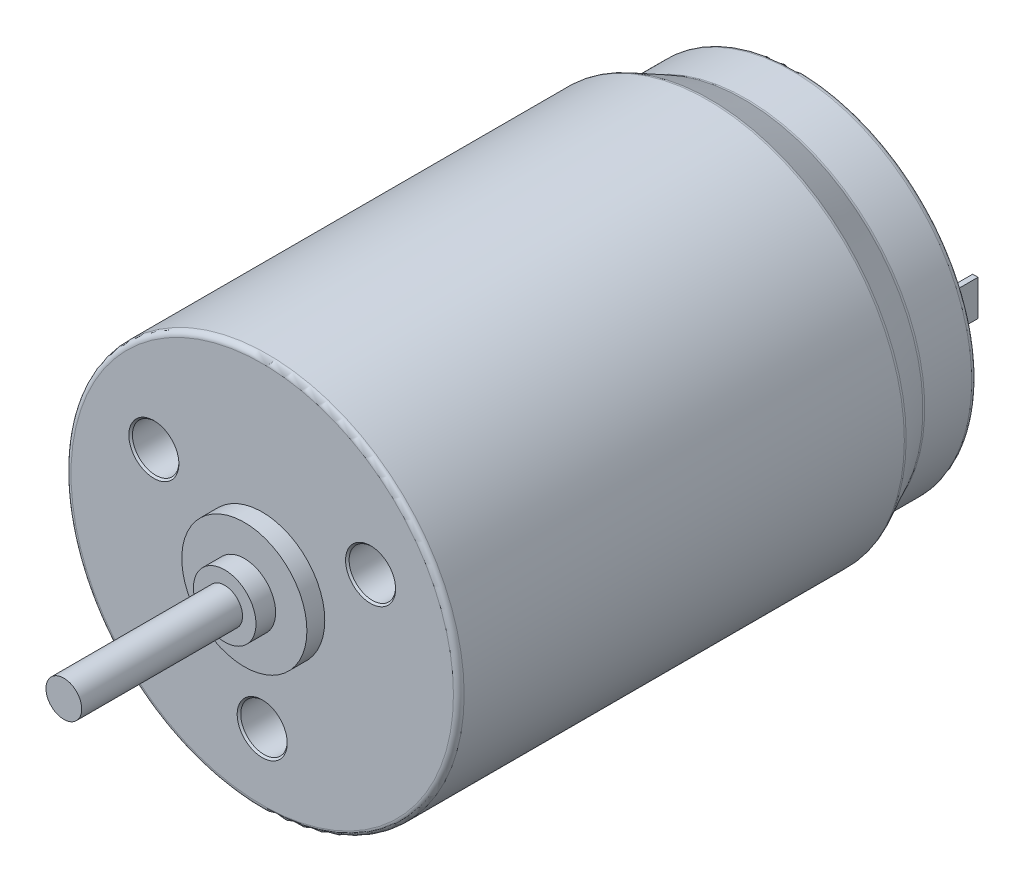
ISO-10303-21;
HEADER;
FILE_DESCRIPTION(('STEP AP214'),'2;1');
FILE_NAME('part.step','',(''),(''),'','','');
FILE_SCHEMA(('AUTOMOTIVE_DESIGN { 1 0 10303 214 1 1 1 1 }'));
ENDSEC;
DATA;
#1=APPLICATION_CONTEXT('core data for automotive mechanical design processes');
#2=APPLICATION_PROTOCOL_DEFINITION('international standard','automotive_design',2000,#1);
#3=PRODUCT_CONTEXT('',#1,'mechanical');
#4=PRODUCT('Part','Part','',(#3));
#5=PRODUCT_RELATED_PRODUCT_CATEGORY('part','',(#4));
#6=PRODUCT_DEFINITION_FORMATION('','',#4);
#7=PRODUCT_DEFINITION_CONTEXT('part definition',#1,'design');
#8=PRODUCT_DEFINITION('design','',#6,#7);
#9=PRODUCT_DEFINITION_SHAPE('','',#8);
#10=(LENGTH_UNIT() NAMED_UNIT(*) SI_UNIT(.MILLI.,.METRE.));
#11=(NAMED_UNIT(*) PLANE_ANGLE_UNIT() SI_UNIT($,.RADIAN.));
#12=(NAMED_UNIT(*) SI_UNIT($,.STERADIAN.) SOLID_ANGLE_UNIT());
#13=UNCERTAINTY_MEASURE_WITH_UNIT(LENGTH_MEASURE(1.E-05),#10,'distance_accuracy_value','');
#14=(GEOMETRIC_REPRESENTATION_CONTEXT(3) GLOBAL_UNCERTAINTY_ASSIGNED_CONTEXT((#13)) GLOBAL_UNIT_ASSIGNED_CONTEXT((#10,
#11,#12)) REPRESENTATION_CONTEXT('',''));
#15=CARTESIAN_POINT('',(0.,0.,0.));
#16=DIRECTION('',(0.,0.,1.));
#17=DIRECTION('',(1.,0.,0.));
#18=AXIS2_PLACEMENT_3D('',#15,#16,#17);
#19=CARTESIAN_POINT('',(0.,0.,-30.));
#20=DIRECTION('',(0.,0.,-1.));
#21=DIRECTION('',(-1.,0.,0.));
#22=AXIS2_PLACEMENT_3D('',#19,#20,#21);
#23=PLANE('',#22);
#24=CARTESIAN_POINT('',(0.,0.,-30.));
#25=DIRECTION('',(0.,0.,-1.));
#26=DIRECTION('',(-1.,0.,0.));
#27=AXIS2_PLACEMENT_3D('',#24,#25,#26);
#28=CIRCLE('',#27,9.7);
#29=CARTESIAN_POINT('',(-9.7,0.,-30.));
#30=VERTEX_POINT('',#29);
#31=EDGE_CURVE('E166',#30,#30,#28,.T.);
#32=ORIENTED_EDGE('',*,*,#31,.T.);
#33=EDGE_LOOP('',(#32));
#34=FACE_BOUND('',#33,.T.);
#35=DIRECTION('',(1.,0.,0.));
#36=VECTOR('',#35,1.);
#37=CARTESIAN_POINT('',(6.15,1.,-30.));
#38=LINE('',#37,#36);
#39=CARTESIAN_POINT('',(5.85,1.,-30.));
#40=VERTEX_POINT('',#39);
#41=CARTESIAN_POINT('',(6.15,1.,-30.));
#42=VERTEX_POINT('',#41);
#43=EDGE_CURVE('E131',#40,#42,#38,.T.);
#44=ORIENTED_EDGE('',*,*,#43,.F.);
#45=DIRECTION('',(0.,1.,0.));
#46=VECTOR('',#45,1.);
#47=CARTESIAN_POINT('',(5.85,1.,-30.));
#48=LINE('',#47,#46);
#49=CARTESIAN_POINT('',(5.85,-1.,-30.));
#50=VERTEX_POINT('',#49);
#51=EDGE_CURVE('E128',#50,#40,#48,.T.);
#52=ORIENTED_EDGE('',*,*,#51,.F.);
#53=DIRECTION('',(-1.,0.,0.));
#54=VECTOR('',#53,1.);
#55=CARTESIAN_POINT('',(6.15,-1.,-30.));
#56=LINE('',#55,#54);
#57=CARTESIAN_POINT('',(6.15,-1.,-30.));
#58=VERTEX_POINT('',#57);
#59=EDGE_CURVE('E140',#58,#50,#56,.T.);
#60=ORIENTED_EDGE('',*,*,#59,.F.);
#61=DIRECTION('',(0.,-1.,0.));
#62=VECTOR('',#61,1.);
#63=CARTESIAN_POINT('',(6.15,1.,-30.));
#64=LINE('',#63,#62);
#65=EDGE_CURVE('E148',#42,#58,#64,.T.);
#66=ORIENTED_EDGE('',*,*,#65,.F.);
#67=EDGE_LOOP('',(#44,#52,#60,#66));
#68=FACE_BOUND('',#67,.T.);
#69=DIRECTION('',(1.,0.,0.));
#70=VECTOR('',#69,1.);
#71=CARTESIAN_POINT('',(-5.85,1.,-30.));
#72=LINE('',#71,#70);
#73=CARTESIAN_POINT('',(-6.15,1.,-30.));
#74=VERTEX_POINT('',#73);
#75=CARTESIAN_POINT('',(-5.85,1.,-30.));
#76=VERTEX_POINT('',#75);
#77=EDGE_CURVE('E594',#74,#76,#72,.T.);
#78=ORIENTED_EDGE('',*,*,#77,.F.);
#79=DIRECTION('',(0.,1.,0.));
#80=VECTOR('',#79,1.);
#81=CARTESIAN_POINT('',(-6.15,1.,-30.));
#82=LINE('',#81,#80);
#83=CARTESIAN_POINT('',(-6.15,-1.,-30.));
#84=VERTEX_POINT('',#83);
#85=EDGE_CURVE('E126',#84,#74,#82,.T.);
#86=ORIENTED_EDGE('',*,*,#85,.F.);
#87=DIRECTION('',(-1.,0.,0.));
#88=VECTOR('',#87,1.);
#89=CARTESIAN_POINT('',(-5.85,-1.,-30.));
#90=LINE('',#89,#88);
#91=CARTESIAN_POINT('',(-5.85,-1.,-30.));
#92=VERTEX_POINT('',#91);
#93=EDGE_CURVE('E122',#92,#84,#90,.T.);
#94=ORIENTED_EDGE('',*,*,#93,.F.);
#95=DIRECTION('',(0.,-1.,0.));
#96=VECTOR('',#95,1.);
#97=CARTESIAN_POINT('',(-5.85,1.,-30.));
#98=LINE('',#97,#96);
#99=EDGE_CURVE('E591',#76,#92,#98,.T.);
#100=ORIENTED_EDGE('',*,*,#99,.F.);
#101=EDGE_LOOP('',(#78,#86,#94,#100));
#102=FACE_BOUND('',#101,.T.);
#103=ADVANCED_FACE('F37',(#34,#68,#102),#23,.T.);
#104=CARTESIAN_POINT('',(0.,0.,-25.));
#105=DIRECTION('',(0.,0.,1.));
#106=DIRECTION('',(1.,0.,0.));
#107=AXIS2_PLACEMENT_3D('',#104,#105,#106);
#108=CYLINDRICAL_SURFACE('',#107,11.);
#109=CARTESIAN_POINT('',(0.,0.,-24.9291796067501));
#110=DIRECTION('',(0.,0.,1.));
#111=DIRECTION('',(1.,0.,0.));
#112=AXIS2_PLACEMENT_3D('',#109,#110,#111);
#113=CIRCLE('',#112,11.);
#114=CARTESIAN_POINT('',(11.,0.,-24.9291796067501));
#115=VERTEX_POINT('',#114);
#116=EDGE_CURVE('E45',#115,#115,#113,.T.);
#117=ORIENTED_EDGE('',*,*,#116,.T.);
#118=EDGE_LOOP('',(#117));
#119=FACE_BOUND('',#118,.T.);
#120=CARTESIAN_POINT('',(0.,0.,-0.300000000000002));
#121=DIRECTION('',(0.,0.,1.));
#122=DIRECTION('',(1.,0.,0.));
#123=AXIS2_PLACEMENT_3D('',#120,#121,#122);
#124=CIRCLE('',#123,11.);
#125=CARTESIAN_POINT('',(11.,0.,-0.300000000000002));
#126=VERTEX_POINT('',#125);
#127=EDGE_CURVE('E219',#126,#126,#124,.F.);
#128=ORIENTED_EDGE('',*,*,#127,.T.);
#129=EDGE_LOOP('',(#128));
#130=FACE_BOUND('',#129,.T.);
#131=ADVANCED_FACE('F224',(#119,#130),#108,.T.);
#132=CARTESIAN_POINT('',(0.,0.,0.));
#133=DIRECTION('',(0.,0.,1.));
#134=DIRECTION('',(1.,0.,0.));
#135=AXIS2_PLACEMENT_3D('',#132,#133,#134);
#136=PLANE('',#135);
#137=CARTESIAN_POINT('',(0.,0.,0.));
#138=DIRECTION('',(0.,0.,1.));
#139=DIRECTION('',(1.,0.,0.));
#140=AXIS2_PLACEMENT_3D('',#137,#138,#139);
#141=CIRCLE('',#140,10.7);
#142=CARTESIAN_POINT('',(10.7,0.,0.));
#143=VERTEX_POINT('',#142);
#144=EDGE_CURVE('E12',#143,#143,#141,.T.);
#145=ORIENTED_EDGE('',*,*,#144,.T.);
#146=EDGE_LOOP('',(#145));
#147=FACE_BOUND('',#146,.T.);
#148=CARTESIAN_POINT('',(0.,0.,0.));
#149=DIRECTION('',(0.,0.,1.));
#150=DIRECTION('',(1.,0.,0.));
#151=AXIS2_PLACEMENT_3D('',#148,#149,#150);
#152=CIRCLE('',#151,3.5);
#153=CARTESIAN_POINT('',(3.5,0.,0.));
#154=VERTEX_POINT('',#153);
#155=EDGE_CURVE('E170',#154,#154,#152,.T.);
#156=ORIENTED_EDGE('',*,*,#155,.F.);
#157=EDGE_LOOP('',(#156));
#158=FACE_BOUND('',#157,.T.);
#159=CARTESIAN_POINT('',(0.,-7.,0.));
#160=DIRECTION('',(0.,0.,1.));
#161=DIRECTION('',(1.,0.,0.));
#162=AXIS2_PLACEMENT_3D('',#159,#160,#161);
#163=CIRCLE('',#162,1.4);
#164=CARTESIAN_POINT('',(1.4,-7.,0.));
#165=VERTEX_POINT('',#164);
#166=EDGE_CURVE('E197',#165,#165,#163,.F.);
#167=ORIENTED_EDGE('',*,*,#166,.T.);
#168=EDGE_LOOP('',(#167));
#169=FACE_BOUND('',#168,.T.);
#170=CARTESIAN_POINT('',(6.06217782649108,3.49999999999998,0.));
#171=DIRECTION('',(0.,0.,1.));
#172=DIRECTION('',(1.,0.,0.));
#173=AXIS2_PLACEMENT_3D('',#170,#171,#172);
#174=CIRCLE('',#173,1.40000000000001);
#175=CARTESIAN_POINT('',(7.46217782649109,3.49999999999998,0.));
#176=VERTEX_POINT('',#175);
#177=EDGE_CURVE('E194',#176,#176,#174,.F.);
#178=ORIENTED_EDGE('',*,*,#177,.T.);
#179=EDGE_LOOP('',(#178));
#180=FACE_BOUND('',#179,.T.);
#181=CARTESIAN_POINT('',(-6.06217782649108,3.49999999999998,0.));
#182=DIRECTION('',(0.,0.,1.));
#183=DIRECTION('',(1.,0.,0.));
#184=AXIS2_PLACEMENT_3D('',#181,#182,#183);
#185=CIRCLE('',#184,1.40000000000001);
#186=CARTESIAN_POINT('',(-4.66217782649107,3.49999999999998,0.));
#187=VERTEX_POINT('',#186);
#188=EDGE_CURVE('E191',#187,#187,#185,.F.);
#189=ORIENTED_EDGE('',*,*,#188,.T.);
#190=EDGE_LOOP('',(#189));
#191=FACE_BOUND('',#190,.T.);
#192=ADVANCED_FACE('F236',(#147,#158,#169,#180,#191),#136,.T.);
#193=CARTESIAN_POINT('',(0.,0.,-27.));
#194=DIRECTION('',(0.,0.,1.));
#195=DIRECTION('',(1.,0.,0.));
#196=AXIS2_PLACEMENT_3D('',#193,#194,#195);
#197=CONICAL_SURFACE('',#196,10.,0.463647609000805);
#198=CARTESIAN_POINT('',(0.,0.,-26.9366563146));
#199=DIRECTION('',(0.,0.,-1.));
#200=DIRECTION('',(-1.,0.,0.));
#201=AXIS2_PLACEMENT_3D('',#198,#199,#200);
#202=CIRCLE('',#201,10.0316718427);
#203=CARTESIAN_POINT('',(-10.0316718427,0.,-26.9366563146));
#204=VERTEX_POINT('',#203);
#205=EDGE_CURVE('E216',#204,#204,#202,.F.);
#206=ORIENTED_EDGE('',*,*,#205,.T.);
#207=EDGE_LOOP('',(#206));
#208=FACE_BOUND('',#207,.T.);
#209=CARTESIAN_POINT('',(0.,0.,-25.0633436854));
#210=DIRECTION('',(0.,0.,-1.));
#211=DIRECTION('',(-1.,0.,0.));
#212=AXIS2_PLACEMENT_3D('',#209,#210,#211);
#213=CIRCLE('',#212,10.9683281573);
#214=CARTESIAN_POINT('',(-10.9683281573,0.,-25.0633436854));
#215=VERTEX_POINT('',#214);
#216=EDGE_CURVE('E213',#215,#215,#213,.T.);
#217=ORIENTED_EDGE('',*,*,#216,.T.);
#218=EDGE_LOOP('',(#217));
#219=FACE_BOUND('',#218,.T.);
#220=ADVANCED_FACE('F233',(#208,#219),#197,.T.);
#221=CARTESIAN_POINT('',(0.,0.,-30.));
#222=DIRECTION('',(0.,0.,1.));
#223=DIRECTION('',(1.,0.,0.));
#224=AXIS2_PLACEMENT_3D('',#221,#222,#223);
#225=CYLINDRICAL_SURFACE('',#224,10.);
#226=CARTESIAN_POINT('',(0.,0.,-29.7));
#227=DIRECTION('',(0.,0.,-1.));
#228=DIRECTION('',(-1.,0.,0.));
#229=AXIS2_PLACEMENT_3D('',#226,#227,#228);
#230=CIRCLE('',#229,10.);
#231=CARTESIAN_POINT('',(-10.,0.,-29.7));
#232=VERTEX_POINT('',#231);
#233=EDGE_CURVE('E210',#232,#232,#230,.F.);
#234=ORIENTED_EDGE('',*,*,#233,.T.);
#235=EDGE_LOOP('',(#234));
#236=FACE_BOUND('',#235,.T.);
#237=CARTESIAN_POINT('',(0.,0.,-27.0708203932499));
#238=DIRECTION('',(0.,0.,-1.));
#239=DIRECTION('',(-1.,0.,0.));
#240=AXIS2_PLACEMENT_3D('',#237,#238,#239);
#241=CIRCLE('',#240,10.);
#242=CARTESIAN_POINT('',(-10.,0.,-27.0708203932499));
#243=VERTEX_POINT('',#242);
#244=EDGE_CURVE('E207',#243,#243,#241,.T.);
#245=ORIENTED_EDGE('',*,*,#244,.T.);
#246=EDGE_LOOP('',(#245));
#247=FACE_BOUND('',#246,.T.);
#248=ADVANCED_FACE('F235',(#236,#247),#225,.T.);
#249=CARTESIAN_POINT('',(0.,-7.,-5.));
#250=DIRECTION('',(0.,0.,1.));
#251=DIRECTION('',(1.,0.,0.));
#252=AXIS2_PLACEMENT_3D('',#249,#250,#251);
#253=CYLINDRICAL_SURFACE('',#252,1.3);
#254=CARTESIAN_POINT('',(0.,-7.,-0.0999999999999951));
#255=DIRECTION('',(0.,0.,1.));
#256=DIRECTION('',(1.,0.,0.));
#257=AXIS2_PLACEMENT_3D('',#254,#255,#256);
#258=CIRCLE('',#257,1.3);
#259=CARTESIAN_POINT('',(1.3,-7.,-0.0999999999999951));
#260=VERTEX_POINT('',#259);
#261=EDGE_CURVE('E183',#260,#260,#258,.T.);
#262=ORIENTED_EDGE('',*,*,#261,.T.);
#263=EDGE_LOOP('',(#262));
#264=FACE_BOUND('',#263,.T.);
#265=CARTESIAN_POINT('',(0.,-7.,-5.));
#266=DIRECTION('',(0.,0.,1.));
#267=DIRECTION('',(1.,0.,0.));
#268=AXIS2_PLACEMENT_3D('',#265,#266,#267);
#269=CIRCLE('',#268,1.3);
#270=CARTESIAN_POINT('',(1.3,-7.,-5.));
#271=VERTEX_POINT('',#270);
#272=EDGE_CURVE('E177',#271,#271,#269,.T.);
#273=ORIENTED_EDGE('',*,*,#272,.F.);
#274=EDGE_LOOP('',(#273));
#275=FACE_BOUND('',#274,.T.);
#276=ADVANCED_FACE('F243',(#264,#275),#253,.F.);
#277=CARTESIAN_POINT('',(0.,-7.,-5.));
#278=DIRECTION('',(0.,0.,1.));
#279=DIRECTION('',(1.,0.,0.));
#280=AXIS2_PLACEMENT_3D('',#277,#278,#279);
#281=PLANE('',#280);
#282=ORIENTED_EDGE('',*,*,#272,.T.);
#283=EDGE_LOOP('',(#282));
#284=FACE_BOUND('',#283,.T.);
#285=ADVANCED_FACE('F259',(#284),#281,.T.);
#286=CARTESIAN_POINT('',(6.06217782649108,3.49999999999998,-5.));
#287=DIRECTION('',(0.,0.,1.));
#288=DIRECTION('',(1.,0.,0.));
#289=AXIS2_PLACEMENT_3D('',#286,#287,#288);
#290=CYLINDRICAL_SURFACE('',#289,1.3);
#291=CARTESIAN_POINT('',(6.06217782649108,3.49999999999998,-0.100000000000004));
#292=DIRECTION('',(0.,0.,1.));
#293=DIRECTION('',(1.,0.,0.));
#294=AXIS2_PLACEMENT_3D('',#291,#292,#293);
#295=CIRCLE('',#294,1.3);
#296=CARTESIAN_POINT('',(7.36217782649108,3.49999999999998,-0.100000000000004));
#297=VERTEX_POINT('',#296);
#298=EDGE_CURVE('E200',#297,#297,#295,.T.);
#299=ORIENTED_EDGE('',*,*,#298,.T.);
#300=EDGE_LOOP('',(#299));
#301=FACE_BOUND('',#300,.T.);
#302=CARTESIAN_POINT('',(6.06217782649108,3.49999999999998,-5.));
#303=DIRECTION('',(0.,0.,1.));
#304=DIRECTION('',(1.,0.,0.));
#305=AXIS2_PLACEMENT_3D('',#302,#303,#304);
#306=CIRCLE('',#305,1.3);
#307=CARTESIAN_POINT('',(7.36217782649108,3.49999999999998,-5.));
#308=VERTEX_POINT('',#307);
#309=EDGE_CURVE('E184',#308,#308,#306,.T.);
#310=ORIENTED_EDGE('',*,*,#309,.F.);
#311=EDGE_LOOP('',(#310));
#312=FACE_BOUND('',#311,.T.);
#313=ADVANCED_FACE('F263',(#301,#312),#290,.F.);
#314=CARTESIAN_POINT('',(6.06217782649108,3.49999999999998,-5.));
#315=DIRECTION('',(0.,0.,1.));
#316=DIRECTION('',(1.,0.,0.));
#317=AXIS2_PLACEMENT_3D('',#314,#315,#316);
#318=PLANE('',#317);
#319=ORIENTED_EDGE('',*,*,#309,.T.);
#320=EDGE_LOOP('',(#319));
#321=FACE_BOUND('',#320,.T.);
#322=ADVANCED_FACE('F267',(#321),#318,.T.);
#323=CARTESIAN_POINT('',(-6.06217782649108,3.49999999999998,-5.));
#324=DIRECTION('',(0.,0.,1.));
#325=DIRECTION('',(1.,0.,0.));
#326=AXIS2_PLACEMENT_3D('',#323,#324,#325);
#327=CYLINDRICAL_SURFACE('',#326,1.3);
#328=CARTESIAN_POINT('',(-6.06217782649108,3.49999999999998,-0.100000000000004));
#329=DIRECTION('',(0.,0.,1.));
#330=DIRECTION('',(1.,0.,0.));
#331=AXIS2_PLACEMENT_3D('',#328,#329,#330);
#332=CIRCLE('',#331,1.3);
#333=CARTESIAN_POINT('',(-4.76217782649108,3.49999999999998,-0.100000000000004));
#334=VERTEX_POINT('',#333);
#335=EDGE_CURVE('E173',#334,#334,#332,.T.);
#336=ORIENTED_EDGE('',*,*,#335,.T.);
#337=EDGE_LOOP('',(#336));
#338=FACE_BOUND('',#337,.T.);
#339=CARTESIAN_POINT('',(-6.06217782649108,3.49999999999998,-5.));
#340=DIRECTION('',(0.,0.,1.));
#341=DIRECTION('',(1.,0.,0.));
#342=AXIS2_PLACEMENT_3D('',#339,#340,#341);
#343=CIRCLE('',#342,1.3);
#344=CARTESIAN_POINT('',(-4.76217782649108,3.49999999999998,-5.));
#345=VERTEX_POINT('',#344);
#346=EDGE_CURVE('E180',#345,#345,#343,.T.);
#347=ORIENTED_EDGE('',*,*,#346,.F.);
#348=EDGE_LOOP('',(#347));
#349=FACE_BOUND('',#348,.T.);
#350=ADVANCED_FACE('F271',(#338,#349),#327,.F.);
#351=CARTESIAN_POINT('',(-6.06217782649108,3.49999999999998,-5.));
#352=DIRECTION('',(0.,0.,1.));
#353=DIRECTION('',(1.,0.,0.));
#354=AXIS2_PLACEMENT_3D('',#351,#352,#353);
#355=PLANE('',#354);
#356=ORIENTED_EDGE('',*,*,#346,.T.);
#357=EDGE_LOOP('',(#356));
#358=FACE_BOUND('',#357,.T.);
#359=ADVANCED_FACE('F275',(#358),#355,.T.);
#360=CARTESIAN_POINT('',(0.,-7.,-0.0999999999999951));
#361=DIRECTION('',(0.,0.,1.));
#362=DIRECTION('',(1.,0.,0.));
#363=AXIS2_PLACEMENT_3D('',#360,#361,#362);
#364=CONICAL_SURFACE('',#363,1.3,0.785398163397466);
#365=ORIENTED_EDGE('',*,*,#166,.F.);
#366=EDGE_LOOP('',(#365));
#367=FACE_BOUND('',#366,.T.);
#368=ORIENTED_EDGE('',*,*,#261,.F.);
#369=EDGE_LOOP('',(#368));
#370=FACE_BOUND('',#369,.T.);
#371=ADVANCED_FACE('F279',(#367,#370),#364,.F.);
#372=CARTESIAN_POINT('',(6.06217782649108,3.49999999999998,-0.100000000000004));
#373=DIRECTION('',(0.,0.,1.));
#374=DIRECTION('',(1.,0.,0.));
#375=AXIS2_PLACEMENT_3D('',#372,#373,#374);
#376=CONICAL_SURFACE('',#375,1.3,0.785398163397475);
#377=ORIENTED_EDGE('',*,*,#177,.F.);
#378=EDGE_LOOP('',(#377));
#379=FACE_BOUND('',#378,.T.);
#380=ORIENTED_EDGE('',*,*,#298,.F.);
#381=EDGE_LOOP('',(#380));
#382=FACE_BOUND('',#381,.T.);
#383=ADVANCED_FACE('F353',(#379,#382),#376,.F.);
#384=CARTESIAN_POINT('',(-6.06217782649108,3.49999999999998,-0.100000000000004));
#385=DIRECTION('',(0.,0.,1.));
#386=DIRECTION('',(1.,0.,0.));
#387=AXIS2_PLACEMENT_3D('',#384,#385,#386);
#388=CONICAL_SURFACE('',#387,1.3,0.785398163397475);
#389=ORIENTED_EDGE('',*,*,#188,.F.);
#390=EDGE_LOOP('',(#389));
#391=FACE_BOUND('',#390,.T.);
#392=ORIENTED_EDGE('',*,*,#335,.F.);
#393=EDGE_LOOP('',(#392));
#394=FACE_BOUND('',#393,.T.);
#395=ADVANCED_FACE('F285',(#391,#394),#388,.F.);
#396=CARTESIAN_POINT('',(0.,0.,1.));
#397=DIRECTION('',(0.,0.,-1.));
#398=DIRECTION('',(-1.,0.,0.));
#399=AXIS2_PLACEMENT_3D('',#396,#397,#398);
#400=CYLINDRICAL_SURFACE('',#399,3.5);
#401=CARTESIAN_POINT('',(0.,0.,1.));
#402=DIRECTION('',(0.,0.,1.));
#403=DIRECTION('',(1.,0.,0.));
#404=AXIS2_PLACEMENT_3D('',#401,#402,#403);
#405=CIRCLE('',#404,3.5);
#406=CARTESIAN_POINT('',(3.5,0.,1.));
#407=VERTEX_POINT('',#406);
#408=EDGE_CURVE('E174',#407,#407,#405,.T.);
#409=ORIENTED_EDGE('',*,*,#408,.F.);
#410=EDGE_LOOP('',(#409));
#411=FACE_BOUND('',#410,.T.);
#412=ORIENTED_EDGE('',*,*,#155,.T.);
#413=EDGE_LOOP('',(#412));
#414=FACE_BOUND('',#413,.T.);
#415=ADVANCED_FACE('F281',(#411,#414),#400,.T.);
#416=CARTESIAN_POINT('',(0.,0.,1.));
#417=DIRECTION('',(0.,0.,1.));
#418=DIRECTION('',(1.,0.,0.));
#419=AXIS2_PLACEMENT_3D('',#416,#417,#418);
#420=PLANE('',#419);
#421=CARTESIAN_POINT('',(0.,0.,1.));
#422=DIRECTION('',(0.,0.,1.));
#423=DIRECTION('',(1.,0.,0.));
#424=AXIS2_PLACEMENT_3D('',#421,#422,#423);
#425=CIRCLE('',#424,1.75);
#426=CARTESIAN_POINT('',(1.75,0.,1.));
#427=VERTEX_POINT('',#426);
#428=EDGE_CURVE('E167',#427,#427,#425,.T.);
#429=ORIENTED_EDGE('',*,*,#428,.F.);
#430=EDGE_LOOP('',(#429));
#431=FACE_BOUND('',#430,.T.);
#432=ORIENTED_EDGE('',*,*,#408,.T.);
#433=EDGE_LOOP('',(#432));
#434=FACE_BOUND('',#433,.T.);
#435=ADVANCED_FACE('F284',(#431,#434),#420,.T.);
#436=CARTESIAN_POINT('',(0.,0.,2.1));
#437=DIRECTION('',(0.,0.,-1.));
#438=DIRECTION('',(-1.,0.,0.));
#439=AXIS2_PLACEMENT_3D('',#436,#437,#438);
#440=CYLINDRICAL_SURFACE('',#439,1.75);
#441=CARTESIAN_POINT('',(0.,0.,2.1));
#442=DIRECTION('',(0.,0.,1.));
#443=DIRECTION('',(1.,0.,0.));
#444=AXIS2_PLACEMENT_3D('',#441,#442,#443);
#445=CIRCLE('',#444,1.75);
#446=CARTESIAN_POINT('',(1.75,0.,2.1));
#447=VERTEX_POINT('',#446);
#448=EDGE_CURVE('E162',#447,#447,#445,.T.);
#449=ORIENTED_EDGE('',*,*,#448,.F.);
#450=EDGE_LOOP('',(#449));
#451=FACE_BOUND('',#450,.T.);
#452=ORIENTED_EDGE('',*,*,#428,.T.);
#453=EDGE_LOOP('',(#452));
#454=FACE_BOUND('',#453,.T.);
#455=ADVANCED_FACE('F289',(#451,#454),#440,.T.);
#456=CARTESIAN_POINT('',(0.,0.,2.1));
#457=DIRECTION('',(0.,0.,1.));
#458=DIRECTION('',(1.,0.,0.));
#459=AXIS2_PLACEMENT_3D('',#456,#457,#458);
#460=PLANE('',#459);
#461=CARTESIAN_POINT('',(0.,0.,2.1));
#462=DIRECTION('',(0.,0.,1.));
#463=DIRECTION('',(1.,0.,0.));
#464=AXIS2_PLACEMENT_3D('',#461,#462,#463);
#465=CIRCLE('',#464,1.);
#466=CARTESIAN_POINT('',(1.,0.,2.1));
#467=VERTEX_POINT('',#466);
#468=EDGE_CURVE('E163',#467,#467,#465,.T.);
#469=ORIENTED_EDGE('',*,*,#468,.F.);
#470=EDGE_LOOP('',(#469));
#471=FACE_BOUND('',#470,.T.);
#472=ORIENTED_EDGE('',*,*,#448,.T.);
#473=EDGE_LOOP('',(#472));
#474=FACE_BOUND('',#473,.T.);
#475=ADVANCED_FACE('F293',(#471,#474),#460,.T.);
#476=CARTESIAN_POINT('',(0.,0.,11.1));
#477=DIRECTION('',(0.,0.,-1.));
#478=DIRECTION('',(-1.,0.,0.));
#479=AXIS2_PLACEMENT_3D('',#476,#477,#478);
#480=CYLINDRICAL_SURFACE('',#479,1.);
#481=CARTESIAN_POINT('',(0.,0.,11.1));
#482=DIRECTION('',(0.,0.,1.));
#483=DIRECTION('',(1.,0.,0.));
#484=AXIS2_PLACEMENT_3D('',#481,#482,#483);
#485=CIRCLE('',#484,1.);
#486=CARTESIAN_POINT('',(1.,0.,11.1));
#487=VERTEX_POINT('',#486);
#488=EDGE_CURVE('E159',#487,#487,#485,.T.);
#489=ORIENTED_EDGE('',*,*,#488,.F.);
#490=EDGE_LOOP('',(#489));
#491=FACE_BOUND('',#490,.T.);
#492=ORIENTED_EDGE('',*,*,#468,.T.);
#493=EDGE_LOOP('',(#492));
#494=FACE_BOUND('',#493,.T.);
#495=ADVANCED_FACE('F297',(#491,#494),#480,.T.);
#496=CARTESIAN_POINT('',(0.,0.,11.1));
#497=DIRECTION('',(0.,0.,1.));
#498=DIRECTION('',(1.,0.,0.));
#499=AXIS2_PLACEMENT_3D('',#496,#497,#498);
#500=PLANE('',#499);
#501=ORIENTED_EDGE('',*,*,#488,.T.);
#502=EDGE_LOOP('',(#501));
#503=FACE_BOUND('',#502,.T.);
#504=ADVANCED_FACE('F301',(#503),#500,.T.);
#505=CARTESIAN_POINT('',(5.85,1.,-33.9));
#506=DIRECTION('',(1.,0.,0.));
#507=DIRECTION('',(0.,0.,-1.));
#508=AXIS2_PLACEMENT_3D('',#505,#506,#507);
#509=PLANE('',#508);
#510=ORIENTED_EDGE('',*,*,#51,.T.);
#511=DIRECTION('',(0.,0.,1.));
#512=VECTOR('',#511,1.);
#513=CARTESIAN_POINT('',(5.85,1.,-33.9));
#514=LINE('',#513,#512);
#515=CARTESIAN_POINT('',(5.85,1.,-33.9));
#516=VERTEX_POINT('',#515);
#517=EDGE_CURVE('E157',#516,#40,#514,.T.);
#518=ORIENTED_EDGE('',*,*,#517,.F.);
#519=DIRECTION('',(0.,1.,0.));
#520=VECTOR('',#519,1.);
#521=CARTESIAN_POINT('',(5.85,1.,-33.9));
#522=LINE('',#521,#520);
#523=CARTESIAN_POINT('',(5.85,-1.,-33.9));
#524=VERTEX_POINT('',#523);
#525=EDGE_CURVE('E136',#524,#516,#522,.T.);
#526=ORIENTED_EDGE('',*,*,#525,.F.);
#527=DIRECTION('',(0.,0.,1.));
#528=VECTOR('',#527,1.);
#529=CARTESIAN_POINT('',(5.85,-1.,-33.9));
#530=LINE('',#529,#528);
#531=EDGE_CURVE('E145',#524,#50,#530,.T.);
#532=ORIENTED_EDGE('',*,*,#531,.T.);
#533=EDGE_LOOP('',(#510,#518,#526,#532));
#534=FACE_BOUND('',#533,.T.);
#535=ADVANCED_FACE('F305',(#534),#509,.F.);
#536=CARTESIAN_POINT('',(6.15,1.,-33.9));
#537=DIRECTION('',(0.,-1.,0.));
#538=DIRECTION('',(0.,0.,-1.));
#539=AXIS2_PLACEMENT_3D('',#536,#537,#538);
#540=PLANE('',#539);
#541=ORIENTED_EDGE('',*,*,#43,.T.);
#542=DIRECTION('',(0.,0.,1.));
#543=VECTOR('',#542,1.);
#544=CARTESIAN_POINT('',(6.15,1.,-33.9));
#545=LINE('',#544,#543);
#546=CARTESIAN_POINT('',(6.15,1.,-33.9));
#547=VERTEX_POINT('',#546);
#548=EDGE_CURVE('E154',#547,#42,#545,.T.);
#549=ORIENTED_EDGE('',*,*,#548,.F.);
#550=DIRECTION('',(1.,0.,0.));
#551=VECTOR('',#550,1.);
#552=CARTESIAN_POINT('',(6.15,1.,-33.9));
#553=LINE('',#552,#551);
#554=EDGE_CURVE('E139',#516,#547,#553,.T.);
#555=ORIENTED_EDGE('',*,*,#554,.F.);
#556=ORIENTED_EDGE('',*,*,#517,.T.);
#557=EDGE_LOOP('',(#541,#549,#555,#556));
#558=FACE_BOUND('',#557,.T.);
#559=ADVANCED_FACE('F309',(#558),#540,.F.);
#560=CARTESIAN_POINT('',(6.15,1.,-33.9));
#561=DIRECTION('',(-1.,0.,0.));
#562=DIRECTION('',(0.,0.,1.));
#563=AXIS2_PLACEMENT_3D('',#560,#561,#562);
#564=PLANE('',#563);
#565=ORIENTED_EDGE('',*,*,#65,.T.);
#566=DIRECTION('',(0.,0.,1.));
#567=VECTOR('',#566,1.);
#568=CARTESIAN_POINT('',(6.15,-1.,-33.9));
#569=LINE('',#568,#567);
#570=CARTESIAN_POINT('',(6.15,-1.,-33.9));
#571=VERTEX_POINT('',#570);
#572=EDGE_CURVE('E60',#571,#58,#569,.T.);
#573=ORIENTED_EDGE('',*,*,#572,.F.);
#574=DIRECTION('',(0.,-1.,0.));
#575=VECTOR('',#574,1.);
#576=CARTESIAN_POINT('',(6.15,1.,-33.9));
#577=LINE('',#576,#575);
#578=EDGE_CURVE('E142',#547,#571,#577,.T.);
#579=ORIENTED_EDGE('',*,*,#578,.F.);
#580=ORIENTED_EDGE('',*,*,#548,.T.);
#581=EDGE_LOOP('',(#565,#573,#579,#580));
#582=FACE_BOUND('',#581,.T.);
#583=ADVANCED_FACE('F313',(#582),#564,.F.);
#584=CARTESIAN_POINT('',(6.15,-1.,-33.9));
#585=DIRECTION('',(0.,1.,0.));
#586=DIRECTION('',(0.,0.,1.));
#587=AXIS2_PLACEMENT_3D('',#584,#585,#586);
#588=PLANE('',#587);
#589=ORIENTED_EDGE('',*,*,#59,.T.);
#590=ORIENTED_EDGE('',*,*,#531,.F.);
#591=DIRECTION('',(-1.,0.,0.));
#592=VECTOR('',#591,1.);
#593=CARTESIAN_POINT('',(6.15,-1.,-33.9));
#594=LINE('',#593,#592);
#595=EDGE_CURVE('E144',#571,#524,#594,.T.);
#596=ORIENTED_EDGE('',*,*,#595,.F.);
#597=ORIENTED_EDGE('',*,*,#572,.T.);
#598=EDGE_LOOP('',(#589,#590,#596,#597));
#599=FACE_BOUND('',#598,.T.);
#600=ADVANCED_FACE('F317',(#599),#588,.F.);
#601=CARTESIAN_POINT('',(0.,0.,-33.9));
#602=DIRECTION('',(0.,0.,-1.));
#603=DIRECTION('',(-1.,0.,0.));
#604=AXIS2_PLACEMENT_3D('',#601,#602,#603);
#605=PLANE('',#604);
#606=ORIENTED_EDGE('',*,*,#525,.T.);
#607=ORIENTED_EDGE('',*,*,#554,.T.);
#608=ORIENTED_EDGE('',*,*,#578,.T.);
#609=ORIENTED_EDGE('',*,*,#595,.T.);
#610=EDGE_LOOP('',(#606,#607,#608,#609));
#611=FACE_BOUND('',#610,.T.);
#612=ADVANCED_FACE('F321',(#611),#605,.T.);
#613=CARTESIAN_POINT('',(-6.15,1.,-33.9));
#614=DIRECTION('',(1.,0.,0.));
#615=DIRECTION('',(0.,0.,-1.));
#616=AXIS2_PLACEMENT_3D('',#613,#614,#615);
#617=PLANE('',#616);
#618=ORIENTED_EDGE('',*,*,#85,.T.);
#619=DIRECTION('',(0.,0.,1.));
#620=VECTOR('',#619,1.);
#621=CARTESIAN_POINT('',(-6.15,1.,-33.9));
#622=LINE('',#621,#620);
#623=CARTESIAN_POINT('',(-6.15,1.,-33.9));
#624=VERTEX_POINT('',#623);
#625=EDGE_CURVE('E107',#624,#74,#622,.T.);
#626=ORIENTED_EDGE('',*,*,#625,.F.);
#627=DIRECTION('',(0.,1.,0.));
#628=VECTOR('',#627,1.);
#629=CARTESIAN_POINT('',(-6.15,1.,-33.9));
#630=LINE('',#629,#628);
#631=CARTESIAN_POINT('',(-6.15,-1.,-33.9));
#632=VERTEX_POINT('',#631);
#633=EDGE_CURVE('E114',#632,#624,#630,.T.);
#634=ORIENTED_EDGE('',*,*,#633,.F.);
#635=DIRECTION('',(0.,0.,1.));
#636=VECTOR('',#635,1.);
#637=CARTESIAN_POINT('',(-6.15,-1.,-33.9));
#638=LINE('',#637,#636);
#639=EDGE_CURVE('E588',#632,#84,#638,.T.);
#640=ORIENTED_EDGE('',*,*,#639,.T.);
#641=EDGE_LOOP('',(#618,#626,#634,#640));
#642=FACE_BOUND('',#641,.T.);
#643=ADVANCED_FACE('F124',(#642),#617,.F.);
#644=CARTESIAN_POINT('',(-5.85,1.,-33.9));
#645=DIRECTION('',(0.,-1.,0.));
#646=DIRECTION('',(1.,0.,0.));
#647=AXIS2_PLACEMENT_3D('',#644,#645,#646);
#648=PLANE('',#647);
#649=ORIENTED_EDGE('',*,*,#77,.T.);
#650=DIRECTION('',(0.,0.,1.));
#651=VECTOR('',#650,1.);
#652=CARTESIAN_POINT('',(-5.85,1.,-33.9));
#653=LINE('',#652,#651);
#654=CARTESIAN_POINT('',(-5.85,1.,-33.9));
#655=VERTEX_POINT('',#654);
#656=EDGE_CURVE('E110',#655,#76,#653,.T.);
#657=ORIENTED_EDGE('',*,*,#656,.F.);
#658=DIRECTION('',(1.,0.,0.));
#659=VECTOR('',#658,1.);
#660=CARTESIAN_POINT('',(-5.85,1.,-33.9));
#661=LINE('',#660,#659);
#662=EDGE_CURVE('E103',#624,#655,#661,.T.);
#663=ORIENTED_EDGE('',*,*,#662,.F.);
#664=ORIENTED_EDGE('',*,*,#625,.T.);
#665=EDGE_LOOP('',(#649,#657,#663,#664));
#666=FACE_BOUND('',#665,.T.);
#667=ADVANCED_FACE('F105',(#666),#648,.F.);
#668=CARTESIAN_POINT('',(-5.85,1.,-33.9));
#669=DIRECTION('',(-1.,0.,0.));
#670=DIRECTION('',(0.,0.,1.));
#671=AXIS2_PLACEMENT_3D('',#668,#669,#670);
#672=PLANE('',#671);
#673=ORIENTED_EDGE('',*,*,#99,.T.);
#674=DIRECTION('',(0.,0.,1.));
#675=VECTOR('',#674,1.);
#676=CARTESIAN_POINT('',(-5.85,-1.,-33.9));
#677=LINE('',#676,#675);
#678=CARTESIAN_POINT('',(-5.85,-1.,-33.9));
#679=VERTEX_POINT('',#678);
#680=EDGE_CURVE('E52',#679,#92,#677,.T.);
#681=ORIENTED_EDGE('',*,*,#680,.F.);
#682=DIRECTION('',(0.,-1.,0.));
#683=VECTOR('',#682,1.);
#684=CARTESIAN_POINT('',(-5.85,1.,-33.9));
#685=LINE('',#684,#683);
#686=EDGE_CURVE('E113',#655,#679,#685,.T.);
#687=ORIENTED_EDGE('',*,*,#686,.F.);
#688=ORIENTED_EDGE('',*,*,#656,.T.);
#689=EDGE_LOOP('',(#673,#681,#687,#688));
#690=FACE_BOUND('',#689,.T.);
#691=ADVANCED_FACE('F329',(#690),#672,.F.);
#692=CARTESIAN_POINT('',(-5.85,-1.,-33.9));
#693=DIRECTION('',(0.,1.,0.));
#694=DIRECTION('',(0.,0.,1.));
#695=AXIS2_PLACEMENT_3D('',#692,#693,#694);
#696=PLANE('',#695);
#697=ORIENTED_EDGE('',*,*,#93,.T.);
#698=ORIENTED_EDGE('',*,*,#639,.F.);
#699=DIRECTION('',(-1.,0.,0.));
#700=VECTOR('',#699,1.);
#701=CARTESIAN_POINT('',(-5.85,-1.,-33.9));
#702=LINE('',#701,#700);
#703=EDGE_CURVE('E118',#679,#632,#702,.T.);
#704=ORIENTED_EDGE('',*,*,#703,.F.);
#705=ORIENTED_EDGE('',*,*,#680,.T.);
#706=EDGE_LOOP('',(#697,#698,#704,#705));
#707=FACE_BOUND('',#706,.T.);
#708=ADVANCED_FACE('F332',(#707),#696,.F.);
#709=CARTESIAN_POINT('',(0.,0.,-33.9));
#710=DIRECTION('',(0.,0.,-1.));
#711=DIRECTION('',(-1.,0.,0.));
#712=AXIS2_PLACEMENT_3D('',#709,#710,#711);
#713=PLANE('',#712);
#714=ORIENTED_EDGE('',*,*,#633,.T.);
#715=ORIENTED_EDGE('',*,*,#662,.T.);
#716=ORIENTED_EDGE('',*,*,#686,.T.);
#717=ORIENTED_EDGE('',*,*,#703,.T.);
#718=EDGE_LOOP('',(#714,#715,#716,#717));
#719=FACE_BOUND('',#718,.T.);
#720=ADVANCED_FACE('F117',(#719),#713,.T.);
#721=CARTESIAN_POINT('',(0.,0.,-29.7));
#722=DIRECTION('',(0.,0.,-1.));
#723=DIRECTION('',(-1.,0.,0.));
#724=AXIS2_PLACEMENT_3D('',#721,#722,#723);
#725=TOROIDAL_SURFACE('',#724,9.7,0.3);
#726=ORIENTED_EDGE('',*,*,#233,.F.);
#727=EDGE_LOOP('',(#726));
#728=FACE_BOUND('',#727,.T.);
#729=ORIENTED_EDGE('',*,*,#31,.F.);
#730=EDGE_LOOP('',(#729));
#731=FACE_BOUND('',#730,.T.);
#732=ADVANCED_FACE('F337',(#728,#731),#725,.T.);
#733=CARTESIAN_POINT('',(0.,0.,-27.0708203932499));
#734=DIRECTION('',(0.,0.,-1.));
#735=DIRECTION('',(-1.,0.,0.));
#736=AXIS2_PLACEMENT_3D('',#733,#734,#735);
#737=TOROIDAL_SURFACE('',#736,10.3,0.3);
#738=ORIENTED_EDGE('',*,*,#205,.F.);
#739=EDGE_LOOP('',(#738));
#740=FACE_BOUND('',#739,.T.);
#741=ORIENTED_EDGE('',*,*,#244,.F.);
#742=EDGE_LOOP('',(#741));
#743=FACE_BOUND('',#742,.T.);
#744=ADVANCED_FACE('F230',(#740,#743),#737,.F.);
#745=CARTESIAN_POINT('',(0.,0.,-24.9291796067501));
#746=DIRECTION('',(0.,0.,1.));
#747=DIRECTION('',(1.,0.,0.));
#748=AXIS2_PLACEMENT_3D('',#745,#746,#747);
#749=TOROIDAL_SURFACE('',#748,10.7,0.3);
#750=ORIENTED_EDGE('',*,*,#116,.F.);
#751=EDGE_LOOP('',(#750));
#752=FACE_BOUND('',#751,.T.);
#753=ORIENTED_EDGE('',*,*,#216,.F.);
#754=EDGE_LOOP('',(#753));
#755=FACE_BOUND('',#754,.T.);
#756=ADVANCED_FACE('F227',(#752,#755),#749,.T.);
#757=CARTESIAN_POINT('',(0.,0.,-0.300000000000002));
#758=DIRECTION('',(0.,0.,1.));
#759=DIRECTION('',(1.,0.,0.));
#760=AXIS2_PLACEMENT_3D('',#757,#758,#759);
#761=TOROIDAL_SURFACE('',#760,10.7,0.3);
#762=ORIENTED_EDGE('',*,*,#127,.F.);
#763=EDGE_LOOP('',(#762));
#764=FACE_BOUND('',#763,.T.);
#765=ORIENTED_EDGE('',*,*,#144,.F.);
#766=EDGE_LOOP('',(#765));
#767=FACE_BOUND('',#766,.T.);
#768=ADVANCED_FACE('F39',(#764,#767),#761,.T.);
#769=CLOSED_SHELL('',(#103,#131,#192,#220,#248,#276,#285,#313,#322,#350,#359,#371,#383,#395,
#415,#435,#455,#475,#495,#504,#535,#559,#583,#600,#612,#643,#667,#691,#708,#720,#732,#744,#756,#768));
#770=MANIFOLD_SOLID_BREP('B2',#769);
#771=ADVANCED_BREP_SHAPE_REPRESENTATION('',(#18,#770),#14);
#772=SHAPE_DEFINITION_REPRESENTATION(#9,#771);
ENDSEC;
END-ISO-10303-21;
